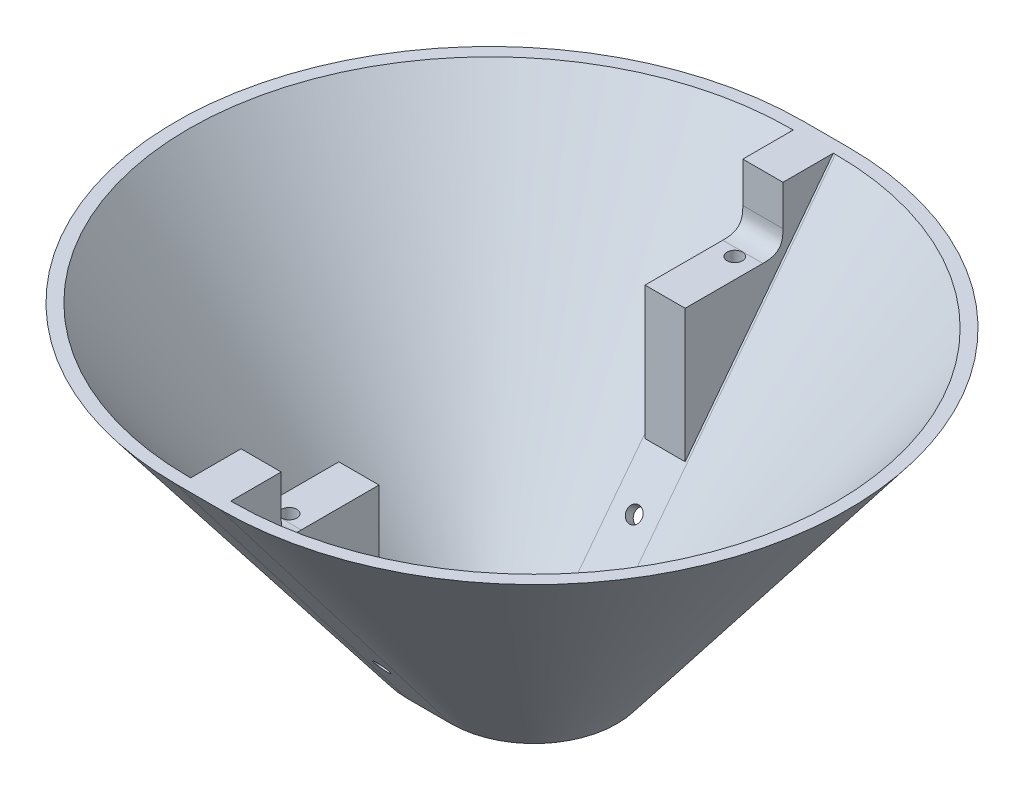
ISO-10303-21;
HEADER;
FILE_DESCRIPTION(('STEP AP214'),'2;1');
FILE_NAME('part.step','',(''),(''),'','','');
FILE_SCHEMA(('AUTOMOTIVE_DESIGN { 1 0 10303 214 1 1 1 1 }'));
ENDSEC;
DATA;
#1=APPLICATION_CONTEXT('core data for automotive mechanical design processes');
#2=APPLICATION_PROTOCOL_DEFINITION('international standard','automotive_design',2000,#1);
#3=PRODUCT_CONTEXT('',#1,'mechanical');
#4=PRODUCT('Part','Part','',(#3));
#5=PRODUCT_RELATED_PRODUCT_CATEGORY('part','',(#4));
#6=PRODUCT_DEFINITION_FORMATION('','',#4);
#7=PRODUCT_DEFINITION_CONTEXT('part definition',#1,'design');
#8=PRODUCT_DEFINITION('design','',#6,#7);
#9=PRODUCT_DEFINITION_SHAPE('','',#8);
#10=(LENGTH_UNIT() NAMED_UNIT(*) SI_UNIT(.MILLI.,.METRE.));
#11=(NAMED_UNIT(*) PLANE_ANGLE_UNIT() SI_UNIT($,.RADIAN.));
#12=(NAMED_UNIT(*) SI_UNIT($,.STERADIAN.) SOLID_ANGLE_UNIT());
#13=UNCERTAINTY_MEASURE_WITH_UNIT(LENGTH_MEASURE(1.E-05),#10,'distance_accuracy_value','');
#14=(GEOMETRIC_REPRESENTATION_CONTEXT(3) GLOBAL_UNCERTAINTY_ASSIGNED_CONTEXT((#13)) GLOBAL_UNIT_ASSIGNED_CONTEXT((#10,
#11,#12)) REPRESENTATION_CONTEXT('',''));
#15=CARTESIAN_POINT('',(0.,0.,0.));
#16=DIRECTION('',(0.,0.,1.));
#17=DIRECTION('',(1.,0.,0.));
#18=AXIS2_PLACEMENT_3D('',#15,#16,#17);
#19=CARTESIAN_POINT('',(-2.,12.15,-15.255049172629));
#20=DIRECTION('',(0.,0.,1.));
#21=DIRECTION('',(1.,0.,0.));
#22=AXIS2_PLACEMENT_3D('',#19,#20,#21);
#23=PLANE('',#22);
#24=DIRECTION('',(0.,-1.,0.));
#25=VECTOR('',#24,1.);
#26=CARTESIAN_POINT('',(2.,12.15,-15.255049172629));
#27=LINE('',#26,#25);
#28=CARTESIAN_POINT('',(2.,27.0393487414483,-15.255049172629));
#29=VERTEX_POINT('',#28);
#30=CARTESIAN_POINT('',(2.,13.7926796317046,-15.255049172629));
#31=VERTEX_POINT('',#30);
#32=EDGE_CURVE('E196',#29,#31,#27,.T.);
#33=ORIENTED_EDGE('',*,*,#32,.F.);
#34=DIRECTION('',(1.,0.,0.));
#35=VECTOR('',#34,1.);
#36=CARTESIAN_POINT('',(-2.,27.0393487414483,-15.255049172629));
#37=LINE('',#36,#35);
#38=CARTESIAN_POINT('',(-2.,27.0393487414483,-15.255049172629));
#39=VERTEX_POINT('',#38);
#40=EDGE_CURVE('E183',#39,#29,#37,.T.);
#41=ORIENTED_EDGE('',*,*,#40,.F.);
#42=DIRECTION('',(0.,-1.,0.));
#43=VECTOR('',#42,1.);
#44=CARTESIAN_POINT('',(-2.,12.15,-15.255049172629));
#45=LINE('',#44,#43);
#46=CARTESIAN_POINT('',(-2.,13.7926796317046,-15.255049172629));
#47=VERTEX_POINT('',#46);
#48=EDGE_CURVE('E194',#39,#47,#45,.T.);
#49=ORIENTED_EDGE('',*,*,#48,.T.);
#50=DIRECTION('',(-1.,0.,0.));
#51=VECTOR('',#50,1.);
#52=CARTESIAN_POINT('',(0.,13.7926796317046,-15.255049172629));
#53=LINE('',#52,#51);
#54=EDGE_CURVE('E313',#31,#47,#53,.T.);
#55=ORIENTED_EDGE('',*,*,#54,.F.);
#56=EDGE_LOOP('',(#33,#41,#49,#55));
#57=FACE_BOUND('',#56,.T.);
#58=ADVANCED_FACE('F38',(#57),#23,.T.);
#59=CARTESIAN_POINT('',(-2.19999999999997,3.03934874144826,7.00372816986759));
#60=DIRECTION('',(0.,1.,0.));
#61=DIRECTION('',(0.,0.,1.));
#62=AXIS2_PLACEMENT_3D('',#59,#60,#61);
#63=PLANE('',#62);
#64=DIRECTION('',(-1.,0.,0.));
#65=VECTOR('',#64,1.);
#66=CARTESIAN_POINT('',(0.,3.03934874144826,7.00372816986759));
#67=LINE('',#66,#65);
#68=CARTESIAN_POINT('',(2.19999999999997,3.03934874144826,7.00372816986759));
#69=VERTEX_POINT('',#68);
#70=CARTESIAN_POINT('',(-2.19999999999997,3.03934874144826,7.00372816986759));
#71=VERTEX_POINT('',#70);
#72=EDGE_CURVE('E274',#69,#71,#67,.T.);
#73=ORIENTED_EDGE('',*,*,#72,.F.);
#74=CARTESIAN_POINT('',(2.2,3.03934874144826,0.));
#75=DIRECTION('',(0.,1.,0.));
#76=DIRECTION('',(0.,0.,-1.));
#77=AXIS2_PLACEMENT_3D('',#74,#75,#76);
#78=CIRCLE('',#77,7.00372816986759);
#79=CARTESIAN_POINT('',(2.19999999999998,3.03934874144826,-7.00372816986759));
#80=VERTEX_POINT('',#79);
#81=EDGE_CURVE('E253',#69,#80,#78,.T.);
#82=ORIENTED_EDGE('',*,*,#81,.T.);
#83=DIRECTION('',(-1.,0.,0.));
#84=VECTOR('',#83,1.);
#85=CARTESIAN_POINT('',(0.,3.03934874144826,-7.0037281698676));
#86=LINE('',#85,#84);
#87=CARTESIAN_POINT('',(-2.19999999999998,3.03934874144826,-7.00372816986759));
#88=VERTEX_POINT('',#87);
#89=EDGE_CURVE('E267',#80,#88,#86,.T.);
#90=ORIENTED_EDGE('',*,*,#89,.T.);
#91=CARTESIAN_POINT('',(-2.2,3.03934874144826,0.));
#92=DIRECTION('',(0.,-1.,0.));
#93=DIRECTION('',(0.,0.,-1.));
#94=AXIS2_PLACEMENT_3D('',#91,#92,#93);
#95=CIRCLE('',#94,7.00372816986759);
#96=EDGE_CURVE('E298',#71,#88,#95,.T.);
#97=ORIENTED_EDGE('',*,*,#96,.F.);
#98=EDGE_LOOP('',(#73,#82,#90,#97));
#99=FACE_BOUND('',#98,.T.);
#100=CARTESIAN_POINT('',(-2.2,3.03934874144826,0.));
#101=DIRECTION('',(0.,-1.,0.));
#102=DIRECTION('',(0.,0.,-1.));
#103=AXIS2_PLACEMENT_3D('',#100,#101,#102);
#104=CIRCLE('',#103,8.26420058387785);
#105=CARTESIAN_POINT('',(-2.19999999999997,3.03934874144826,8.26420058387785));
#106=VERTEX_POINT('',#105);
#107=CARTESIAN_POINT('',(-2.20000000000003,3.03934874144826,-8.26420058387786));
#108=VERTEX_POINT('',#107);
#109=EDGE_CURVE('E307',#106,#108,#104,.T.);
#110=ORIENTED_EDGE('',*,*,#109,.T.);
#111=DIRECTION('',(-1.,0.,0.));
#112=VECTOR('',#111,1.);
#113=CARTESIAN_POINT('',(0.,3.03934874144826,-8.26420058387786));
#114=LINE('',#113,#112);
#115=CARTESIAN_POINT('',(2.20000000000003,3.03934874144826,-8.26420058387786));
#116=VERTEX_POINT('',#115);
#117=EDGE_CURVE('E265',#116,#108,#114,.T.);
#118=ORIENTED_EDGE('',*,*,#117,.F.);
#119=CARTESIAN_POINT('',(2.2,3.03934874144826,0.));
#120=DIRECTION('',(0.,1.,0.));
#121=DIRECTION('',(0.,0.,-1.));
#122=AXIS2_PLACEMENT_3D('',#119,#120,#121);
#123=CIRCLE('',#122,8.26420058387785);
#124=CARTESIAN_POINT('',(2.19999999999997,3.03934874144826,8.26420058387785));
#125=VERTEX_POINT('',#124);
#126=EDGE_CURVE('E262',#125,#116,#123,.T.);
#127=ORIENTED_EDGE('',*,*,#126,.F.);
#128=DIRECTION('',(-1.,0.,0.));
#129=VECTOR('',#128,1.);
#130=CARTESIAN_POINT('',(0.,3.03934874144826,8.26420058387785));
#131=LINE('',#130,#129);
#132=EDGE_CURVE('E277',#125,#106,#131,.T.);
#133=ORIENTED_EDGE('',*,*,#132,.T.);
#134=EDGE_LOOP('',(#110,#118,#127,#133));
#135=FACE_BOUND('',#134,.T.);
#136=ADVANCED_FACE('F600',(#99,#135),#63,.F.);
#137=CARTESIAN_POINT('',(-2.2,33.0393487414483,0.));
#138=DIRECTION('',(0.,1.,0.));
#139=DIRECTION('',(0.,0.,1.));
#140=AXIS2_PLACEMENT_3D('',#137,#138,#139);
#141=CONICAL_SURFACE('',#140,31.2840102232464,0.654498469497869);
#142=CARTESIAN_POINT('',(-2.2,33.0393487414483,0.));
#143=DIRECTION('',(0.,-1.,0.));
#144=DIRECTION('',(0.,0.,-1.));
#145=AXIS2_PLACEMENT_3D('',#142,#143,#144);
#146=CIRCLE('',#145,31.2840102232464);
#147=CARTESIAN_POINT('',(-2.19999999999989,33.0393487414483,31.2840102232464));
#148=VERTEX_POINT('',#147);
#149=CARTESIAN_POINT('',(-2.2000000000001,33.0393487414483,-31.2840102232464));
#150=VERTEX_POINT('',#149);
#151=EDGE_CURVE('E304',#148,#150,#146,.T.);
#152=ORIENTED_EDGE('',*,*,#151,.T.);
#153=DIRECTION('',(0.,-0.793353340291238,0.608761429008717));
#154=VECTOR('',#153,1.);
#155=CARTESIAN_POINT('',(-2.19999999999998,3.03934874144826,-8.26420058387786));
#156=LINE('',#155,#154);
#157=EDGE_CURVE('E289',#150,#108,#156,.T.);
#158=ORIENTED_EDGE('',*,*,#157,.T.);
#159=ORIENTED_EDGE('',*,*,#109,.F.);
#160=DIRECTION('',(0.,-0.793353340291238,-0.608761429008717));
#161=VECTOR('',#160,1.);
#162=CARTESIAN_POINT('',(-2.19999999999997,3.03934874144826,8.26420058387785));
#163=LINE('',#162,#161);
#164=EDGE_CURVE('E295',#148,#106,#163,.T.);
#165=ORIENTED_EDGE('',*,*,#164,.F.);
#166=EDGE_LOOP('',(#152,#158,#159,#165));
#167=FACE_BOUND('',#166,.T.);
#168=ADVANCED_FACE('F411',(#167),#141,.T.);
#169=CARTESIAN_POINT('',(-2.19999999999989,33.0393487414483,30.0235378092362));
#170=DIRECTION('',(0.,-1.,0.));
#171=DIRECTION('',(0.,0.,-1.));
#172=AXIS2_PLACEMENT_3D('',#169,#170,#171);
#173=PLANE('',#172);
#174=DIRECTION('',(-1.,0.,0.));
#175=VECTOR('',#174,1.);
#176=CARTESIAN_POINT('',(-1.04950770296597E-13,33.0393487414483,-31.2840102232464));
#177=LINE('',#176,#175);
#178=CARTESIAN_POINT('',(2.2000000000001,33.0393487414483,-31.2840102232464));
#179=VERTEX_POINT('',#178);
#180=EDGE_CURVE('E272',#179,#150,#177,.T.);
#181=ORIENTED_EDGE('',*,*,#180,.T.);
#182=ORIENTED_EDGE('',*,*,#151,.F.);
#183=DIRECTION('',(-1.,0.,0.));
#184=VECTOR('',#183,1.);
#185=CARTESIAN_POINT('',(1.13624387676481E-13,33.0393487414483,31.2840102232464));
#186=LINE('',#185,#184);
#187=CARTESIAN_POINT('',(2.19999999999989,33.0393487414483,31.2840102232464));
#188=VERTEX_POINT('',#187);
#189=EDGE_CURVE('E280',#188,#148,#186,.T.);
#190=ORIENTED_EDGE('',*,*,#189,.F.);
#191=CARTESIAN_POINT('',(2.2,33.0393487414483,0.));
#192=DIRECTION('',(0.,1.,0.));
#193=DIRECTION('',(0.,0.,-1.));
#194=AXIS2_PLACEMENT_3D('',#191,#192,#193);
#195=CIRCLE('',#194,31.2840102232464);
#196=EDGE_CURVE('E259',#188,#179,#195,.T.);
#197=ORIENTED_EDGE('',*,*,#196,.T.);
#198=EDGE_LOOP('',(#181,#182,#190,#197));
#199=FACE_BOUND('',#198,.T.);
#200=DIRECTION('',(0.,0.,1.));
#201=VECTOR('',#200,1.);
#202=CARTESIAN_POINT('',(-2.,33.0393487414483,-15.255049172629));
#203=LINE('',#202,#201);
#204=CARTESIAN_POINT('',(-2.,33.0393487414483,-30.0235378092362));
#205=VERTEX_POINT('',#204);
#206=CARTESIAN_POINT('',(-2.,33.0393487414483,-25.));
#207=VERTEX_POINT('',#206);
#208=EDGE_CURVE('E203',#205,#207,#203,.T.);
#209=ORIENTED_EDGE('',*,*,#208,.T.);
#210=DIRECTION('',(-1.,0.,0.));
#211=VECTOR('',#210,1.);
#212=CARTESIAN_POINT('',(-2.,33.0393487414483,-25.));
#213=LINE('',#212,#211);
#214=CARTESIAN_POINT('',(2.,33.0393487414483,-25.));
#215=VERTEX_POINT('',#214);
#216=EDGE_CURVE('E189',#215,#207,#213,.T.);
#217=ORIENTED_EDGE('',*,*,#216,.F.);
#218=DIRECTION('',(0.,0.,1.));
#219=VECTOR('',#218,1.);
#220=CARTESIAN_POINT('',(2.,33.0393487414483,-15.255049172629));
#221=LINE('',#220,#219);
#222=CARTESIAN_POINT('',(2.,33.0393487414483,-30.0235378092362));
#223=VERTEX_POINT('',#222);
#224=EDGE_CURVE('E204',#223,#215,#221,.T.);
#225=ORIENTED_EDGE('',*,*,#224,.F.);
#226=DIRECTION('',(-1.,0.,0.));
#227=VECTOR('',#226,1.);
#228=CARTESIAN_POINT('',(-1.00613961606655E-13,33.0393487414483,-30.0235378092362));
#229=LINE('',#228,#227);
#230=CARTESIAN_POINT('',(2.2000000000001,33.0393487414483,-30.0235378092362));
#231=VERTEX_POINT('',#230);
#232=EDGE_CURVE('E270',#231,#223,#229,.T.);
#233=ORIENTED_EDGE('',*,*,#232,.F.);
#234=CARTESIAN_POINT('',(2.2,33.0393487414483,0.));
#235=DIRECTION('',(0.,1.,0.));
#236=DIRECTION('',(0.,0.,-1.));
#237=AXIS2_PLACEMENT_3D('',#234,#235,#236);
#238=CIRCLE('',#237,30.0235378092362);
#239=CARTESIAN_POINT('',(2.19999999999989,33.0393487414483,30.0235378092362));
#240=VERTEX_POINT('',#239);
#241=EDGE_CURVE('E256',#240,#231,#238,.T.);
#242=ORIENTED_EDGE('',*,*,#241,.F.);
#243=DIRECTION('',(-1.,0.,0.));
#244=VECTOR('',#243,1.);
#245=CARTESIAN_POINT('',(1.09287578986539E-13,33.0393487414483,30.0235378092362));
#246=LINE('',#245,#244);
#247=CARTESIAN_POINT('',(2.,33.0393487414483,30.0235378092361));
#248=VERTEX_POINT('',#247);
#249=EDGE_CURVE('E283',#240,#248,#246,.T.);
#250=ORIENTED_EDGE('',*,*,#249,.T.);
#251=DIRECTION('',(0.,0.,1.));
#252=VECTOR('',#251,1.);
#253=CARTESIAN_POINT('',(2.,33.0393487414483,15.255049172629));
#254=LINE('',#253,#252);
#255=CARTESIAN_POINT('',(2.,33.0393487414483,25.));
#256=VERTEX_POINT('',#255);
#257=EDGE_CURVE('E215',#256,#248,#254,.T.);
#258=ORIENTED_EDGE('',*,*,#257,.F.);
#259=DIRECTION('',(1.,0.,0.));
#260=VECTOR('',#259,1.);
#261=CARTESIAN_POINT('',(2.,33.0393487414483,25.));
#262=LINE('',#261,#260);
#263=CARTESIAN_POINT('',(-2.,33.0393487414483,25.));
#264=VERTEX_POINT('',#263);
#265=EDGE_CURVE('E321',#264,#256,#262,.T.);
#266=ORIENTED_EDGE('',*,*,#265,.F.);
#267=DIRECTION('',(0.,0.,1.));
#268=VECTOR('',#267,1.);
#269=CARTESIAN_POINT('',(-2.,33.0393487414483,15.255049172629));
#270=LINE('',#269,#268);
#271=CARTESIAN_POINT('',(-2.,33.0393487414483,30.0235378092362));
#272=VERTEX_POINT('',#271);
#273=EDGE_CURVE('E220',#264,#272,#270,.T.);
#274=ORIENTED_EDGE('',*,*,#273,.T.);
#275=CARTESIAN_POINT('',(-2.19999999999989,33.0393487414483,30.0235378092362));
#276=VERTEX_POINT('',#275);
#277=EDGE_CURVE('E282',#272,#276,#246,.T.);
#278=ORIENTED_EDGE('',*,*,#277,.T.);
#279=CARTESIAN_POINT('',(-2.2,33.0393487414483,0.));
#280=DIRECTION('',(0.,-1.,0.));
#281=DIRECTION('',(0.,0.,-1.));
#282=AXIS2_PLACEMENT_3D('',#279,#280,#281);
#283=CIRCLE('',#282,30.0235378092362);
#284=CARTESIAN_POINT('',(-2.2000000000001,33.0393487414483,-30.0235378092362));
#285=VERTEX_POINT('',#284);
#286=EDGE_CURVE('E301',#276,#285,#283,.T.);
#287=ORIENTED_EDGE('',*,*,#286,.T.);
#288=EDGE_CURVE('E269',#205,#285,#229,.T.);
#289=ORIENTED_EDGE('',*,*,#288,.F.);
#290=EDGE_LOOP('',(#209,#217,#225,#233,#242,#250,#258,#266,#274,#278,#287,#289));
#291=FACE_BOUND('',#290,.T.);
#292=ADVANCED_FACE('F605',(#199,#291),#173,.F.);
#293=CARTESIAN_POINT('',(-2.2,3.03934874144826,0.));
#294=DIRECTION('',(0.,1.,0.));
#295=DIRECTION('',(0.,0.,1.));
#296=AXIS2_PLACEMENT_3D('',#293,#294,#295);
#297=CONICAL_SURFACE('',#296,7.00372816986759,0.654498469497869);
#298=DIRECTION('',(0.,0.793353340291238,0.608761429008717));
#299=VECTOR('',#298,1.);
#300=CARTESIAN_POINT('',(-2.19999999999989,33.0393487414483,30.0235378092362));
#301=LINE('',#300,#299);
#302=EDGE_CURVE('E292',#71,#276,#301,.T.);
#303=ORIENTED_EDGE('',*,*,#302,.F.);
#304=ORIENTED_EDGE('',*,*,#96,.T.);
#305=DIRECTION('',(0.,0.793353340291238,-0.608761429008717));
#306=VECTOR('',#305,1.);
#307=CARTESIAN_POINT('',(-2.1999999999999,33.0393487414483,-30.0235378092362));
#308=LINE('',#307,#306);
#309=EDGE_CURVE('E286',#88,#285,#308,.T.);
#310=ORIENTED_EDGE('',*,*,#309,.T.);
#311=ORIENTED_EDGE('',*,*,#286,.F.);
#312=EDGE_LOOP('',(#303,#304,#310,#311));
#313=FACE_BOUND('',#312,.T.);
#314=ADVANCED_FACE('F598',(#313),#297,.F.);
#315=CARTESIAN_POINT('',(1.09287578986539E-13,33.0393487414483,30.0235378092362));
#316=DIRECTION('',(0.,-0.608761429008717,0.793353340291238));
#317=DIRECTION('',(0.,-0.793353340291238,-0.608761429008717));
#318=AXIS2_PLACEMENT_3D('',#315,#316,#317);
#319=PLANE('',#318);
#320=CARTESIAN_POINT('',(0.,9.77897929181878,12.1752285801743));
#321=DIRECTION('',(0.,-0.608761429008716,0.793353340291238));
#322=DIRECTION('',(0.,-0.793353340291238,-0.608761429008716));
#323=AXIS2_PLACEMENT_3D('',#320,#321,#322);
#324=CIRCLE('',#323,0.760000000000002);
#325=CARTESIAN_POINT('',(0.,9.17603075319744,11.7125698941277));
#326=VERTEX_POINT('',#325);
#327=EDGE_CURVE('E236',#326,#326,#324,.T.);
#328=ORIENTED_EDGE('',*,*,#327,.T.);
#329=EDGE_LOOP('',(#328));
#330=FACE_BOUND('',#329,.T.);
#331=ORIENTED_EDGE('',*,*,#277,.F.);
#332=DIRECTION('',(0.,-0.793353340291238,-0.608761429008717));
#333=VECTOR('',#332,1.);
#334=CARTESIAN_POINT('',(-2.,33.0393487414483,30.0235378092362));
#335=LINE('',#334,#333);
#336=CARTESIAN_POINT('',(-2.,13.7926796317046,15.255049172629));
#337=VERTEX_POINT('',#336);
#338=EDGE_CURVE('E225',#272,#337,#335,.T.);
#339=ORIENTED_EDGE('',*,*,#338,.T.);
#340=DIRECTION('',(1.,0.,0.));
#341=VECTOR('',#340,1.);
#342=CARTESIAN_POINT('',(1.97007027034586E-13,13.7926796317046,15.255049172629));
#343=LINE('',#342,#341);
#344=CARTESIAN_POINT('',(2.,13.7926796317046,15.255049172629));
#345=VERTEX_POINT('',#344);
#346=EDGE_CURVE('E227',#337,#345,#343,.T.);
#347=ORIENTED_EDGE('',*,*,#346,.T.);
#348=DIRECTION('',(0.,-0.793353340291238,-0.608761429008717));
#349=VECTOR('',#348,1.);
#350=CARTESIAN_POINT('',(2.,33.0393487414483,30.0235378092361));
#351=LINE('',#350,#349);
#352=EDGE_CURVE('E222',#248,#345,#351,.T.);
#353=ORIENTED_EDGE('',*,*,#352,.F.);
#354=ORIENTED_EDGE('',*,*,#249,.F.);
#355=DIRECTION('',(0.,0.793353340291238,0.608761429008717));
#356=VECTOR('',#355,1.);
#357=CARTESIAN_POINT('',(2.19999999999989,33.0393487414483,30.0235378092362));
#358=LINE('',#357,#356);
#359=EDGE_CURVE('E247',#69,#240,#358,.T.);
#360=ORIENTED_EDGE('',*,*,#359,.F.);
#361=ORIENTED_EDGE('',*,*,#72,.T.);
#362=ORIENTED_EDGE('',*,*,#302,.T.);
#363=EDGE_LOOP('',(#331,#339,#347,#353,#354,#360,#361,#362));
#364=FACE_BOUND('',#363,.T.);
#365=ADVANCED_FACE('F594',(#330,#364),#319,.F.);
#366=CARTESIAN_POINT('',(0.,3.03934874144826,8.26420058387785));
#367=DIRECTION('',(0.,0.608761429008717,-0.793353340291238));
#368=DIRECTION('',(0.,0.793353340291238,0.608761429008717));
#369=AXIS2_PLACEMENT_3D('',#366,#367,#368);
#370=PLANE('',#369);
#371=ORIENTED_EDGE('',*,*,#189,.T.);
#372=ORIENTED_EDGE('',*,*,#164,.T.);
#373=ORIENTED_EDGE('',*,*,#132,.F.);
#374=DIRECTION('',(0.,-0.793353340291238,-0.608761429008717));
#375=VECTOR('',#374,1.);
#376=CARTESIAN_POINT('',(2.19999999999997,3.03934874144826,8.26420058387785));
#377=LINE('',#376,#375);
#378=EDGE_CURVE('E250',#188,#125,#377,.T.);
#379=ORIENTED_EDGE('',*,*,#378,.F.);
#380=EDGE_LOOP('',(#371,#372,#373,#379));
#381=FACE_BOUND('',#380,.T.);
#382=CARTESIAN_POINT('',(0.,9.17021786281006,12.9685819204656));
#383=DIRECTION('',(0.,0.608761429008717,-0.793353340291238));
#384=DIRECTION('',(0.,0.793353340291238,0.608761429008717));
#385=AXIS2_PLACEMENT_3D('',#382,#383,#384);
#386=CIRCLE('',#385,0.760000000000002);
#387=CARTESIAN_POINT('',(0.,9.77316640143141,13.4312406065122));
#388=VERTEX_POINT('',#387);
#389=EDGE_CURVE('E235',#388,#388,#386,.T.);
#390=ORIENTED_EDGE('',*,*,#389,.T.);
#391=EDGE_LOOP('',(#390));
#392=FACE_BOUND('',#391,.T.);
#393=ADVANCED_FACE('F590',(#381,#392),#370,.F.);
#394=CARTESIAN_POINT('',(-1.04950770296597E-13,33.0393487414483,-31.2840102232464));
#395=DIRECTION('',(0.,0.608761429008717,0.793353340291238));
#396=DIRECTION('',(0.,-0.793353340291238,0.608761429008717));
#397=AXIS2_PLACEMENT_3D('',#394,#395,#396);
#398=PLANE('',#397);
#399=CARTESIAN_POINT('',(0.,9.17021786281005,-12.9685819204656));
#400=DIRECTION('',(0.,0.608761429008717,0.793353340291238));
#401=DIRECTION('',(0.,-0.793353340291238,0.608761429008717));
#402=AXIS2_PLACEMENT_3D('',#399,#400,#401);
#403=CIRCLE('',#402,0.760000000000002);
#404=CARTESIAN_POINT('',(0.,8.56726932418871,-12.5059232344189));
#405=VERTEX_POINT('',#404);
#406=EDGE_CURVE('E232',#405,#405,#403,.F.);
#407=ORIENTED_EDGE('',*,*,#406,.F.);
#408=EDGE_LOOP('',(#407));
#409=FACE_BOUND('',#408,.T.);
#410=ORIENTED_EDGE('',*,*,#157,.F.);
#411=ORIENTED_EDGE('',*,*,#180,.F.);
#412=DIRECTION('',(0.,-0.793353340291238,0.608761429008717));
#413=VECTOR('',#412,1.);
#414=CARTESIAN_POINT('',(2.19999999999998,3.03934874144826,-8.26420058387786));
#415=LINE('',#414,#413);
#416=EDGE_CURVE('E244',#179,#116,#415,.T.);
#417=ORIENTED_EDGE('',*,*,#416,.T.);
#418=ORIENTED_EDGE('',*,*,#117,.T.);
#419=EDGE_LOOP('',(#410,#411,#417,#418));
#420=FACE_BOUND('',#419,.T.);
#421=ADVANCED_FACE('F586',(#409,#420),#398,.F.);
#422=CARTESIAN_POINT('',(0.,3.03934874144826,-7.0037281698676));
#423=DIRECTION('',(0.,-0.608761429008717,-0.793353340291238));
#424=DIRECTION('',(0.,0.793353340291238,-0.608761429008717));
#425=AXIS2_PLACEMENT_3D('',#422,#423,#424);
#426=PLANE('',#425);
#427=CARTESIAN_POINT('',(0.,9.77897929181878,-12.1752285801743));
#428=DIRECTION('',(0.,0.608761429008716,0.793353340291238));
#429=DIRECTION('',(0.,-0.793353340291238,0.608761429008716));
#430=AXIS2_PLACEMENT_3D('',#427,#428,#429);
#431=CIRCLE('',#430,0.760000000000002);
#432=CARTESIAN_POINT('',(0.,9.17603075319744,-11.7125698941277));
#433=VERTEX_POINT('',#432);
#434=EDGE_CURVE('E229',#433,#433,#431,.T.);
#435=ORIENTED_EDGE('',*,*,#434,.F.);
#436=EDGE_LOOP('',(#435));
#437=FACE_BOUND('',#436,.T.);
#438=ORIENTED_EDGE('',*,*,#54,.T.);
#439=DIRECTION('',(0.,0.793353340291238,-0.608761429008717));
#440=VECTOR('',#439,1.);
#441=CARTESIAN_POINT('',(-2.,3.03934874144827,-7.0037281698676));
#442=LINE('',#441,#440);
#443=EDGE_CURVE('E202',#47,#205,#442,.T.);
#444=ORIENTED_EDGE('',*,*,#443,.T.);
#445=ORIENTED_EDGE('',*,*,#288,.T.);
#446=ORIENTED_EDGE('',*,*,#309,.F.);
#447=ORIENTED_EDGE('',*,*,#89,.F.);
#448=DIRECTION('',(0.,0.793353340291238,-0.608761429008717));
#449=VECTOR('',#448,1.);
#450=CARTESIAN_POINT('',(2.1999999999999,33.0393487414483,-30.0235378092362));
#451=LINE('',#450,#449);
#452=EDGE_CURVE('E239',#80,#231,#451,.T.);
#453=ORIENTED_EDGE('',*,*,#452,.T.);
#454=ORIENTED_EDGE('',*,*,#232,.T.);
#455=DIRECTION('',(0.,0.793353340291238,-0.608761429008717));
#456=VECTOR('',#455,1.);
#457=CARTESIAN_POINT('',(2.,3.03934874144826,-7.00372816986761));
#458=LINE('',#457,#456);
#459=EDGE_CURVE('E310',#31,#223,#458,.T.);
#460=ORIENTED_EDGE('',*,*,#459,.F.);
#461=EDGE_LOOP('',(#438,#444,#445,#446,#447,#453,#454,#460));
#462=FACE_BOUND('',#461,.T.);
#463=ADVANCED_FACE('F582',(#437,#462),#426,.F.);
#464=CARTESIAN_POINT('',(2.2,33.0393487414483,0.));
#465=DIRECTION('',(0.,1.,0.));
#466=DIRECTION('',(0.,0.,1.));
#467=AXIS2_PLACEMENT_3D('',#464,#465,#466);
#468=CONICAL_SURFACE('',#467,31.2840102232464,0.654498469497869);
#469=ORIENTED_EDGE('',*,*,#196,.F.);
#470=ORIENTED_EDGE('',*,*,#378,.T.);
#471=ORIENTED_EDGE('',*,*,#126,.T.);
#472=ORIENTED_EDGE('',*,*,#416,.F.);
#473=EDGE_LOOP('',(#469,#470,#471,#472));
#474=FACE_BOUND('',#473,.T.);
#475=ADVANCED_FACE('F578',(#474),#468,.T.);
#476=CARTESIAN_POINT('',(2.2,3.03934874144826,0.));
#477=DIRECTION('',(0.,1.,0.));
#478=DIRECTION('',(0.,0.,1.));
#479=AXIS2_PLACEMENT_3D('',#476,#477,#478);
#480=CONICAL_SURFACE('',#479,7.00372816986759,0.654498469497869);
#481=ORIENTED_EDGE('',*,*,#359,.T.);
#482=ORIENTED_EDGE('',*,*,#241,.T.);
#483=ORIENTED_EDGE('',*,*,#452,.F.);
#484=ORIENTED_EDGE('',*,*,#81,.F.);
#485=EDGE_LOOP('',(#481,#482,#483,#484));
#486=FACE_BOUND('',#485,.T.);
#487=ADVANCED_FACE('F574',(#486),#480,.F.);
#488=CARTESIAN_POINT('',(0.,-1.94835001404263,27.4585816872373));
#489=DIRECTION('',(0.,0.608761429008716,-0.793353340291238));
#490=DIRECTION('',(0.,0.793353340291239,0.608761429008716));
#491=AXIS2_PLACEMENT_3D('',#488,#489,#490);
#492=CYLINDRICAL_SURFACE('',#491,0.760000000000002);
#493=ORIENTED_EDGE('',*,*,#327,.F.);
#494=EDGE_LOOP('',(#493));
#495=FACE_BOUND('',#494,.T.);
#496=ORIENTED_EDGE('',*,*,#389,.F.);
#497=EDGE_LOOP('',(#496));
#498=FACE_BOUND('',#497,.T.);
#499=ADVANCED_FACE('F570',(#495,#498),#492,.F.);
#500=CARTESIAN_POINT('',(0.,-1.94835001404263,-27.4585816872373));
#501=DIRECTION('',(0.,0.608761429008716,0.793353340291238));
#502=DIRECTION('',(0.,-0.793353340291239,0.608761429008716));
#503=AXIS2_PLACEMENT_3D('',#500,#501,#502);
#504=CYLINDRICAL_SURFACE('',#503,0.760000000000002);
#505=ORIENTED_EDGE('',*,*,#434,.T.);
#506=EDGE_LOOP('',(#505));
#507=FACE_BOUND('',#506,.T.);
#508=ORIENTED_EDGE('',*,*,#406,.T.);
#509=EDGE_LOOP('',(#508));
#510=FACE_BOUND('',#509,.T.);
#511=ADVANCED_FACE('F566',(#507,#510),#504,.F.);
#512=CARTESIAN_POINT('',(-2.,12.15,15.255049172629));
#513=DIRECTION('',(0.,0.,-1.));
#514=DIRECTION('',(-1.,0.,0.));
#515=AXIS2_PLACEMENT_3D('',#512,#513,#514);
#516=PLANE('',#515);
#517=DIRECTION('',(-1.,0.,0.));
#518=VECTOR('',#517,1.);
#519=CARTESIAN_POINT('',(2.,27.0393487414483,15.255049172629));
#520=LINE('',#519,#518);
#521=CARTESIAN_POINT('',(2.,27.0393487414483,15.255049172629));
#522=VERTEX_POINT('',#521);
#523=CARTESIAN_POINT('',(-2.,27.0393487414483,15.255049172629));
#524=VERTEX_POINT('',#523);
#525=EDGE_CURVE('E320',#522,#524,#520,.T.);
#526=ORIENTED_EDGE('',*,*,#525,.F.);
#527=DIRECTION('',(0.,1.,0.));
#528=VECTOR('',#527,1.);
#529=CARTESIAN_POINT('',(2.,12.15,15.255049172629));
#530=LINE('',#529,#528);
#531=EDGE_CURVE('E207',#345,#522,#530,.T.);
#532=ORIENTED_EDGE('',*,*,#531,.F.);
#533=ORIENTED_EDGE('',*,*,#346,.F.);
#534=DIRECTION('',(0.,1.,0.));
#535=VECTOR('',#534,1.);
#536=CARTESIAN_POINT('',(-2.,12.15,15.255049172629));
#537=LINE('',#536,#535);
#538=EDGE_CURVE('E217',#337,#524,#537,.T.);
#539=ORIENTED_EDGE('',*,*,#538,.T.);
#540=EDGE_LOOP('',(#526,#532,#533,#539));
#541=FACE_BOUND('',#540,.T.);
#542=ADVANCED_FACE('F548',(#541),#516,.T.);
#543=CARTESIAN_POINT('',(-2.,0.,0.));
#544=DIRECTION('',(-1.,0.,0.));
#545=DIRECTION('',(0.,0.,1.));
#546=AXIS2_PLACEMENT_3D('',#543,#544,#545);
#547=PLANE('',#546);
#548=DIRECTION('',(0.,1.,0.));
#549=VECTOR('',#548,1.);
#550=CARTESIAN_POINT('',(-2.,27.0393487414483,25.));
#551=LINE('',#550,#549);
#552=CARTESIAN_POINT('',(-2.,29.0393487414483,25.));
#553=VERTEX_POINT('',#552);
#554=EDGE_CURVE('E341',#553,#264,#551,.T.);
#555=ORIENTED_EDGE('',*,*,#554,.F.);
#556=CARTESIAN_POINT('',(-2.,27.0393487414483,23.));
#557=CARTESIAN_POINT('',(-2.,27.0393487414483,23.3363961030679));
#558=CARTESIAN_POINT('',(-2.,27.0393487414483,23.6727922061358));
#559=CARTESIAN_POINT('',(-2.,27.1827325811204,24.4142135623731));
#560=CARTESIAN_POINT('',(-2.,27.6251351790752,24.8566161603278));
#561=CARTESIAN_POINT('',(-2.,28.3665565353125,25.));
#562=CARTESIAN_POINT('',(-2.,28.7029526383804,25.));
#563=CARTESIAN_POINT('',(-2.,29.0393487414483,25.));
#564=B_SPLINE_CURVE_WITH_KNOTS('',5,(#556,#557,#558,#559,#560,#561,#562,#563),.UNSPECIFIED.,.F.,
.F.,(6,2,6),(0.,0.5,1.),.UNSPECIFIED.);
#565=CARTESIAN_POINT('',(-2.,27.0393487414483,23.));
#566=VERTEX_POINT('',#565);
#567=EDGE_CURVE('E847',#553,#566,#564,.F.);
#568=ORIENTED_EDGE('',*,*,#567,.T.);
#569=DIRECTION('',(0.,0.,1.));
#570=VECTOR('',#569,1.);
#571=CARTESIAN_POINT('',(-2.,27.0393487414483,15.255049172629));
#572=LINE('',#571,#570);
#573=EDGE_CURVE('E322',#524,#566,#572,.T.);
#574=ORIENTED_EDGE('',*,*,#573,.F.);
#575=ORIENTED_EDGE('',*,*,#538,.F.);
#576=ORIENTED_EDGE('',*,*,#338,.F.);
#577=ORIENTED_EDGE('',*,*,#273,.F.);
#578=EDGE_LOOP('',(#555,#568,#574,#575,#576,#577));
#579=FACE_BOUND('',#578,.T.);
#580=ADVANCED_FACE('F544',(#579),#547,.T.);
#581=CARTESIAN_POINT('',(2.,0.,0.));
#582=DIRECTION('',(-1.,0.,0.));
#583=DIRECTION('',(0.,0.,1.));
#584=AXIS2_PLACEMENT_3D('',#581,#582,#583);
#585=PLANE('',#584);
#586=DIRECTION('',(0.,0.,-1.));
#587=VECTOR('',#586,1.);
#588=CARTESIAN_POINT('',(2.,27.0393487414483,15.255049172629));
#589=LINE('',#588,#587);
#590=CARTESIAN_POINT('',(2.,27.0393487414483,23.));
#591=VERTEX_POINT('',#590);
#592=EDGE_CURVE('E317',#591,#522,#589,.T.);
#593=ORIENTED_EDGE('',*,*,#592,.F.);
#594=CARTESIAN_POINT('',(2.,29.0393487414483,25.));
#595=CARTESIAN_POINT('',(2.,28.7029526383804,25.));
#596=CARTESIAN_POINT('',(2.,28.3665565353125,25.));
#597=CARTESIAN_POINT('',(2.,27.6251351790752,24.8566161603278));
#598=CARTESIAN_POINT('',(2.,27.1827325811204,24.4142135623731));
#599=CARTESIAN_POINT('',(2.,27.0393487414483,23.6727922061358));
#600=CARTESIAN_POINT('',(2.,27.0393487414483,23.3363961030679));
#601=CARTESIAN_POINT('',(2.,27.0393487414483,23.));
#602=B_SPLINE_CURVE_WITH_KNOTS('',5,(#594,#595,#596,#597,#598,#599,#600,#601),.UNSPECIFIED.,.F.,
.F.,(6,2,6),(0.,0.5,1.),.UNSPECIFIED.);
#603=CARTESIAN_POINT('',(2.,29.0393487414483,25.));
#604=VERTEX_POINT('',#603);
#605=EDGE_CURVE('E391',#591,#604,#602,.F.);
#606=ORIENTED_EDGE('',*,*,#605,.T.);
#607=DIRECTION('',(0.,1.,0.));
#608=VECTOR('',#607,1.);
#609=CARTESIAN_POINT('',(2.,27.0393487414483,25.));
#610=LINE('',#609,#608);
#611=EDGE_CURVE('E338',#604,#256,#610,.T.);
#612=ORIENTED_EDGE('',*,*,#611,.T.);
#613=ORIENTED_EDGE('',*,*,#257,.T.);
#614=ORIENTED_EDGE('',*,*,#352,.T.);
#615=ORIENTED_EDGE('',*,*,#531,.T.);
#616=EDGE_LOOP('',(#593,#606,#612,#613,#614,#615));
#617=FACE_BOUND('',#616,.T.);
#618=ADVANCED_FACE('F535',(#617),#585,.F.);
#619=CARTESIAN_POINT('',(-2.,0.,0.));
#620=DIRECTION('',(-1.,0.,0.));
#621=DIRECTION('',(0.,0.,1.));
#622=AXIS2_PLACEMENT_3D('',#619,#620,#621);
#623=PLANE('',#622);
#624=DIRECTION('',(0.,0.,1.));
#625=VECTOR('',#624,1.);
#626=CARTESIAN_POINT('',(-2.,27.0393487414483,-25.));
#627=LINE('',#626,#625);
#628=CARTESIAN_POINT('',(-2.,27.0393487414483,-23.));
#629=VERTEX_POINT('',#628);
#630=EDGE_CURVE('E179',#629,#39,#627,.T.);
#631=ORIENTED_EDGE('',*,*,#630,.F.);
#632=CARTESIAN_POINT('',(-2.,29.0393487414483,-25.));
#633=CARTESIAN_POINT('',(-2.,28.7029526383804,-25.));
#634=CARTESIAN_POINT('',(-2.,28.3665565353125,-25.));
#635=CARTESIAN_POINT('',(-2.,27.6251351790752,-24.8566161603278));
#636=CARTESIAN_POINT('',(-2.,27.1827325811204,-24.4142135623731));
#637=CARTESIAN_POINT('',(-2.,27.0393487414483,-23.6727922061358));
#638=CARTESIAN_POINT('',(-2.,27.0393487414483,-23.3363961030679));
#639=CARTESIAN_POINT('',(-2.,27.0393487414483,-23.));
#640=B_SPLINE_CURVE_WITH_KNOTS('',5,(#632,#633,#634,#635,#636,#637,#638,#639),.UNSPECIFIED.,.F.,
.F.,(6,2,6),(0.,0.5,1.),.UNSPECIFIED.);
#641=CARTESIAN_POINT('',(-2.,29.0393487414483,-25.));
#642=VERTEX_POINT('',#641);
#643=EDGE_CURVE('E51',#629,#642,#640,.F.);
#644=ORIENTED_EDGE('',*,*,#643,.T.);
#645=DIRECTION('',(0.,1.,0.));
#646=VECTOR('',#645,1.);
#647=CARTESIAN_POINT('',(-2.,27.0393487414483,-25.));
#648=LINE('',#647,#646);
#649=EDGE_CURVE('E503',#642,#207,#648,.T.);
#650=ORIENTED_EDGE('',*,*,#649,.T.);
#651=ORIENTED_EDGE('',*,*,#208,.F.);
#652=ORIENTED_EDGE('',*,*,#443,.F.);
#653=ORIENTED_EDGE('',*,*,#48,.F.);
#654=EDGE_LOOP('',(#631,#644,#650,#651,#652,#653));
#655=FACE_BOUND('',#654,.T.);
#656=ADVANCED_FACE('F200',(#655),#623,.T.);
#657=CARTESIAN_POINT('',(2.,0.,0.));
#658=DIRECTION('',(-1.,0.,0.));
#659=DIRECTION('',(0.,0.,1.));
#660=AXIS2_PLACEMENT_3D('',#657,#658,#659);
#661=PLANE('',#660);
#662=ORIENTED_EDGE('',*,*,#224,.T.);
#663=DIRECTION('',(0.,1.,0.));
#664=VECTOR('',#663,1.);
#665=CARTESIAN_POINT('',(2.,27.0393487414483,-25.));
#666=LINE('',#665,#664);
#667=CARTESIAN_POINT('',(2.,29.0393487414483,-25.));
#668=VERTEX_POINT('',#667);
#669=EDGE_CURVE('E497',#668,#215,#666,.T.);
#670=ORIENTED_EDGE('',*,*,#669,.F.);
#671=CARTESIAN_POINT('',(2.,27.0393487414483,-23.));
#672=CARTESIAN_POINT('',(2.,27.0393487414483,-23.3363961030679));
#673=CARTESIAN_POINT('',(2.,27.0393487414483,-23.6727922061358));
#674=CARTESIAN_POINT('',(2.,27.1827325811204,-24.4142135623731));
#675=CARTESIAN_POINT('',(2.,27.6251351790752,-24.8566161603278));
#676=CARTESIAN_POINT('',(2.,28.3665565353125,-25.));
#677=CARTESIAN_POINT('',(2.,28.7029526383804,-25.));
#678=CARTESIAN_POINT('',(2.,29.0393487414483,-25.));
#679=B_SPLINE_CURVE_WITH_KNOTS('',5,(#671,#672,#673,#674,#675,#676,#677,#678),.UNSPECIFIED.,.F.,
.F.,(6,2,6),(0.,0.5,1.),.UNSPECIFIED.);
#680=CARTESIAN_POINT('',(2.,27.0393487414483,-23.));
#681=VERTEX_POINT('',#680);
#682=EDGE_CURVE('E12',#668,#681,#679,.F.);
#683=ORIENTED_EDGE('',*,*,#682,.T.);
#684=DIRECTION('',(0.,0.,-1.));
#685=VECTOR('',#684,1.);
#686=CARTESIAN_POINT('',(2.,27.0393487414483,-25.));
#687=LINE('',#686,#685);
#688=EDGE_CURVE('E197',#29,#681,#687,.T.);
#689=ORIENTED_EDGE('',*,*,#688,.F.);
#690=ORIENTED_EDGE('',*,*,#32,.T.);
#691=ORIENTED_EDGE('',*,*,#459,.T.);
#692=EDGE_LOOP('',(#662,#670,#683,#689,#690,#691));
#693=FACE_BOUND('',#692,.T.);
#694=ADVANCED_FACE('F369',(#693),#661,.F.);
#695=CARTESIAN_POINT('',(-2.,27.0393487414483,-25.));
#696=DIRECTION('',(0.,0.,-1.));
#697=DIRECTION('',(-1.,0.,0.));
#698=AXIS2_PLACEMENT_3D('',#695,#696,#697);
#699=PLANE('',#698);
#700=ORIENTED_EDGE('',*,*,#649,.F.);
#701=CARTESIAN_POINT('',(2.2,29.0393487414483,-25.));
#702=CARTESIAN_POINT('',(0.733333333333331,29.0393487414483,-25.));
#703=CARTESIAN_POINT('',(-0.733333333333336,29.0393487414483,-25.));
#704=CARTESIAN_POINT('',(-2.2,29.0393487414483,-25.));
#705=B_SPLINE_CURVE_WITH_KNOTS('',3,(#701,#702,#703,#704),.UNSPECIFIED.,.F.,.F.,(4,4),(-0.0022,
0.0022),.UNSPECIFIED.);
#706=EDGE_CURVE('E58',#642,#668,#705,.F.);
#707=ORIENTED_EDGE('',*,*,#706,.T.);
#708=ORIENTED_EDGE('',*,*,#669,.T.);
#709=ORIENTED_EDGE('',*,*,#216,.T.);
#710=EDGE_LOOP('',(#700,#707,#708,#709));
#711=FACE_BOUND('',#710,.T.);
#712=ADVANCED_FACE('F373',(#711),#699,.F.);
#713=CARTESIAN_POINT('',(0.,27.0393487414483,0.));
#714=DIRECTION('',(0.,1.,0.));
#715=DIRECTION('',(0.,0.,1.));
#716=AXIS2_PLACEMENT_3D('',#713,#714,#715);
#717=PLANE('',#716);
#718=CARTESIAN_POINT('',(0.,27.0393487414483,-22.2));
#719=DIRECTION('',(0.,1.,0.));
#720=DIRECTION('',(0.,0.,1.));
#721=AXIS2_PLACEMENT_3D('',#718,#719,#720);
#722=CIRCLE('',#721,0.762);
#723=CARTESIAN_POINT('',(0.,27.0393487414483,-21.438));
#724=VERTEX_POINT('',#723);
#725=EDGE_CURVE('E46',#724,#724,#722,.T.);
#726=ORIENTED_EDGE('',*,*,#725,.F.);
#727=EDGE_LOOP('',(#726));
#728=FACE_BOUND('',#727,.T.);
#729=ORIENTED_EDGE('',*,*,#688,.T.);
#730=CARTESIAN_POINT('',(-2.2,27.0393487414483,-23.));
#731=CARTESIAN_POINT('',(-0.733333333333336,27.0393487414483,-23.));
#732=CARTESIAN_POINT('',(0.733333333333331,27.0393487414483,-23.));
#733=CARTESIAN_POINT('',(2.2,27.0393487414483,-23.));
#734=B_SPLINE_CURVE_WITH_KNOTS('',3,(#730,#731,#732,#733),.UNSPECIFIED.,.F.,.F.,(4,4),(-0.0022,
0.0022),.UNSPECIFIED.);
#735=EDGE_CURVE('E186',#681,#629,#734,.F.);
#736=ORIENTED_EDGE('',*,*,#735,.T.);
#737=ORIENTED_EDGE('',*,*,#630,.T.);
#738=ORIENTED_EDGE('',*,*,#40,.T.);
#739=EDGE_LOOP('',(#729,#736,#737,#738));
#740=FACE_BOUND('',#739,.T.);
#741=ADVANCED_FACE('F182',(#728,#740),#717,.T.);
#742=CARTESIAN_POINT('',(2.,27.0393487414483,25.));
#743=DIRECTION('',(0.,0.,1.));
#744=DIRECTION('',(1.,0.,0.));
#745=AXIS2_PLACEMENT_3D('',#742,#743,#744);
#746=PLANE('',#745);
#747=ORIENTED_EDGE('',*,*,#611,.F.);
#748=CARTESIAN_POINT('',(-2.2,29.0393487414483,25.));
#749=CARTESIAN_POINT('',(-0.733333333333333,29.0393487414483,25.));
#750=CARTESIAN_POINT('',(0.733333333333335,29.0393487414483,25.));
#751=CARTESIAN_POINT('',(2.2,29.0393487414483,25.));
#752=B_SPLINE_CURVE_WITH_KNOTS('',3,(#748,#749,#750,#751),.UNSPECIFIED.,.F.,.F.,(4,4),(-0.0022,
0.0022),.UNSPECIFIED.);
#753=EDGE_CURVE('E350',#604,#553,#752,.F.);
#754=ORIENTED_EDGE('',*,*,#753,.T.);
#755=ORIENTED_EDGE('',*,*,#554,.T.);
#756=ORIENTED_EDGE('',*,*,#265,.T.);
#757=EDGE_LOOP('',(#747,#754,#755,#756));
#758=FACE_BOUND('',#757,.T.);
#759=ADVANCED_FACE('F357',(#758),#746,.F.);
#760=CARTESIAN_POINT('',(0.,27.0393487414483,0.));
#761=DIRECTION('',(0.,-1.,0.));
#762=DIRECTION('',(0.,0.,-1.));
#763=AXIS2_PLACEMENT_3D('',#760,#761,#762);
#764=PLANE('',#763);
#765=CARTESIAN_POINT('',(0.,27.0393487414483,22.2));
#766=DIRECTION('',(0.,-1.,0.));
#767=DIRECTION('',(0.,0.,-1.));
#768=AXIS2_PLACEMENT_3D('',#765,#766,#767);
#769=CIRCLE('',#768,0.762);
#770=CARTESIAN_POINT('',(0.,27.0393487414483,21.438));
#771=VERTEX_POINT('',#770);
#772=EDGE_CURVE('E475',#771,#771,#769,.T.);
#773=ORIENTED_EDGE('',*,*,#772,.T.);
#774=EDGE_LOOP('',(#773));
#775=FACE_BOUND('',#774,.T.);
#776=ORIENTED_EDGE('',*,*,#573,.T.);
#777=CARTESIAN_POINT('',(2.2,27.0393487414483,23.));
#778=CARTESIAN_POINT('',(0.733333333333335,27.0393487414483,23.));
#779=CARTESIAN_POINT('',(-0.733333333333333,27.0393487414483,23.));
#780=CARTESIAN_POINT('',(-2.2,27.0393487414483,23.));
#781=B_SPLINE_CURVE_WITH_KNOTS('',3,(#777,#778,#779,#780),.UNSPECIFIED.,.F.,.F.,(4,4),(-0.0022,
0.0022),.UNSPECIFIED.);
#782=EDGE_CURVE('E316',#566,#591,#781,.F.);
#783=ORIENTED_EDGE('',*,*,#782,.T.);
#784=ORIENTED_EDGE('',*,*,#592,.T.);
#785=ORIENTED_EDGE('',*,*,#525,.T.);
#786=EDGE_LOOP('',(#776,#783,#784,#785));
#787=FACE_BOUND('',#786,.T.);
#788=ADVANCED_FACE('F366',(#775,#787),#764,.F.);
#789=CARTESIAN_POINT('',(2.2,29.0393487414483,25.));
#790=CARTESIAN_POINT('',(0.733333333333335,29.0393487414483,25.));
#791=CARTESIAN_POINT('',(-0.733333333333333,29.0393487414483,25.));
#792=CARTESIAN_POINT('',(-2.2,29.0393487414483,25.));
#793=CARTESIAN_POINT('',(2.2,28.7029526383804,25.));
#794=CARTESIAN_POINT('',(0.733333333333335,28.7029526383804,25.));
#795=CARTESIAN_POINT('',(-0.733333333333333,28.7029526383804,25.));
#796=CARTESIAN_POINT('',(-2.2,28.7029526383804,25.));
#797=CARTESIAN_POINT('',(2.2,28.3665565353125,25.));
#798=CARTESIAN_POINT('',(0.733333333333335,28.3665565353125,25.));
#799=CARTESIAN_POINT('',(-0.733333333333333,28.3665565353125,25.));
#800=CARTESIAN_POINT('',(-2.2,28.3665565353125,25.));
#801=CARTESIAN_POINT('',(2.2,27.6251351790752,24.8566161603278));
#802=CARTESIAN_POINT('',(0.733333333333335,27.6251351790752,24.8566161603278));
#803=CARTESIAN_POINT('',(-0.733333333333333,27.6251351790752,24.8566161603278));
#804=CARTESIAN_POINT('',(-2.2,27.6251351790752,24.8566161603278));
#805=CARTESIAN_POINT('',(2.2,27.1827325811204,24.4142135623731));
#806=CARTESIAN_POINT('',(0.733333333333335,27.1827325811204,24.4142135623731));
#807=CARTESIAN_POINT('',(-0.733333333333333,27.1827325811204,24.4142135623731));
#808=CARTESIAN_POINT('',(-2.2,27.1827325811204,24.4142135623731));
#809=CARTESIAN_POINT('',(2.2,27.0393487414483,23.6727922061358));
#810=CARTESIAN_POINT('',(0.733333333333335,27.0393487414483,23.6727922061358));
#811=CARTESIAN_POINT('',(-0.733333333333333,27.0393487414483,23.6727922061358));
#812=CARTESIAN_POINT('',(-2.2,27.0393487414483,23.6727922061358));
#813=CARTESIAN_POINT('',(2.2,27.0393487414483,23.3363961030679));
#814=CARTESIAN_POINT('',(0.733333333333335,27.0393487414483,23.3363961030679));
#815=CARTESIAN_POINT('',(-0.733333333333333,27.0393487414483,23.3363961030679));
#816=CARTESIAN_POINT('',(-2.2,27.0393487414483,23.3363961030679));
#817=CARTESIAN_POINT('',(2.2,27.0393487414483,23.));
#818=CARTESIAN_POINT('',(0.733333333333335,27.0393487414483,23.));
#819=CARTESIAN_POINT('',(-0.733333333333333,27.0393487414483,23.));
#820=CARTESIAN_POINT('',(-2.2,27.0393487414483,23.));
#821=B_SPLINE_SURFACE_WITH_KNOTS('',5,3,((#789,#790,#791,#792),(#793,#794,#795,#796),(#797,#798,
#799,#800),(#801,#802,#803,#804),(#805,#806,#807,#808),(#809,#810,#811,#812),(#813,#814,#815,
#816),(#817,#818,#819,#820)),.UNSPECIFIED.,.F.,.F.,.F.,(6,2,6),(4,4),(0.,0.5,1.),(-0.0022,
0.0022),.UNSPECIFIED.);
#822=ORIENTED_EDGE('',*,*,#567,.F.);
#823=ORIENTED_EDGE('',*,*,#753,.F.);
#824=ORIENTED_EDGE('',*,*,#605,.F.);
#825=ORIENTED_EDGE('',*,*,#782,.F.);
#826=EDGE_LOOP('',(#822,#823,#824,#825));
#827=FACE_BOUND('',#826,.T.);
#828=ADVANCED_FACE('F398',(#827),#821,.T.);
#829=CARTESIAN_POINT('',(2.2,27.0393487414483,-23.));
#830=CARTESIAN_POINT('',(0.733333333333331,27.0393487414483,-23.));
#831=CARTESIAN_POINT('',(-0.733333333333336,27.0393487414483,-23.));
#832=CARTESIAN_POINT('',(-2.2,27.0393487414483,-23.));
#833=CARTESIAN_POINT('',(2.2,27.0393487414483,-23.3363961030679));
#834=CARTESIAN_POINT('',(0.733333333333331,27.0393487414483,-23.3363961030679));
#835=CARTESIAN_POINT('',(-0.733333333333336,27.0393487414483,-23.3363961030679));
#836=CARTESIAN_POINT('',(-2.2,27.0393487414483,-23.3363961030679));
#837=CARTESIAN_POINT('',(2.2,27.0393487414483,-23.6727922061358));
#838=CARTESIAN_POINT('',(0.733333333333331,27.0393487414483,-23.6727922061358));
#839=CARTESIAN_POINT('',(-0.733333333333336,27.0393487414483,-23.6727922061358));
#840=CARTESIAN_POINT('',(-2.2,27.0393487414483,-23.6727922061358));
#841=CARTESIAN_POINT('',(2.2,27.1827325811204,-24.4142135623731));
#842=CARTESIAN_POINT('',(0.733333333333331,27.1827325811204,-24.4142135623731));
#843=CARTESIAN_POINT('',(-0.733333333333336,27.1827325811204,-24.4142135623731));
#844=CARTESIAN_POINT('',(-2.2,27.1827325811204,-24.4142135623731));
#845=CARTESIAN_POINT('',(2.2,27.6251351790752,-24.8566161603278));
#846=CARTESIAN_POINT('',(0.733333333333331,27.6251351790752,-24.8566161603278));
#847=CARTESIAN_POINT('',(-0.733333333333336,27.6251351790752,-24.8566161603278));
#848=CARTESIAN_POINT('',(-2.2,27.6251351790752,-24.8566161603278));
#849=CARTESIAN_POINT('',(2.2,28.3665565353125,-25.));
#850=CARTESIAN_POINT('',(0.733333333333331,28.3665565353125,-25.));
#851=CARTESIAN_POINT('',(-0.733333333333336,28.3665565353125,-25.));
#852=CARTESIAN_POINT('',(-2.2,28.3665565353125,-25.));
#853=CARTESIAN_POINT('',(2.2,28.7029526383804,-25.));
#854=CARTESIAN_POINT('',(0.733333333333331,28.7029526383804,-25.));
#855=CARTESIAN_POINT('',(-0.733333333333336,28.7029526383804,-25.));
#856=CARTESIAN_POINT('',(-2.2,28.7029526383804,-25.));
#857=CARTESIAN_POINT('',(2.2,29.0393487414483,-25.));
#858=CARTESIAN_POINT('',(0.733333333333331,29.0393487414483,-25.));
#859=CARTESIAN_POINT('',(-0.733333333333336,29.0393487414483,-25.));
#860=CARTESIAN_POINT('',(-2.2,29.0393487414483,-25.));
#861=B_SPLINE_SURFACE_WITH_KNOTS('',5,3,((#829,#830,#831,#832),(#833,#834,#835,#836),(#837,#838,
#839,#840),(#841,#842,#843,#844),(#845,#846,#847,#848),(#849,#850,#851,#852),(#853,#854,#855,
#856),(#857,#858,#859,#860)),.UNSPECIFIED.,.F.,.F.,.F.,(6,2,6),(4,4),(0.,0.5,1.),(-0.0022,
0.0022),.UNSPECIFIED.);
#862=ORIENTED_EDGE('',*,*,#682,.F.);
#863=ORIENTED_EDGE('',*,*,#706,.F.);
#864=ORIENTED_EDGE('',*,*,#643,.F.);
#865=ORIENTED_EDGE('',*,*,#735,.F.);
#866=EDGE_LOOP('',(#862,#863,#864,#865));
#867=FACE_BOUND('',#866,.T.);
#868=ADVANCED_FACE('F41',(#867),#861,.T.);
#869=CARTESIAN_POINT('',(0.,25.0393487414483,22.2));
#870=DIRECTION('',(0.,1.,0.));
#871=DIRECTION('',(0.,0.,1.));
#872=AXIS2_PLACEMENT_3D('',#869,#870,#871);
#873=CYLINDRICAL_SURFACE('',#872,0.762);
#874=CARTESIAN_POINT('',(0.,25.0393487414483,22.2));
#875=DIRECTION('',(0.,1.,0.));
#876=DIRECTION('',(0.,0.,1.));
#877=AXIS2_PLACEMENT_3D('',#874,#875,#876);
#878=CIRCLE('',#877,0.762);
#879=CARTESIAN_POINT('',(0.,25.0393487414483,22.962));
#880=VERTEX_POINT('',#879);
#881=EDGE_CURVE('E482',#880,#880,#878,.T.);
#882=ORIENTED_EDGE('',*,*,#881,.F.);
#883=EDGE_LOOP('',(#882));
#884=FACE_BOUND('',#883,.T.);
#885=ORIENTED_EDGE('',*,*,#772,.F.);
#886=EDGE_LOOP('',(#885));
#887=FACE_BOUND('',#886,.T.);
#888=ADVANCED_FACE('F783',(#884,#887),#873,.F.);
#889=CARTESIAN_POINT('',(0.,25.0393487414483,22.2));
#890=DIRECTION('',(0.,1.,0.));
#891=DIRECTION('',(0.,0.,1.));
#892=AXIS2_PLACEMENT_3D('',#889,#890,#891);
#893=PLANE('',#892);
#894=ORIENTED_EDGE('',*,*,#881,.T.);
#895=EDGE_LOOP('',(#894));
#896=FACE_BOUND('',#895,.T.);
#897=ADVANCED_FACE('F789',(#896),#893,.T.);
#898=CARTESIAN_POINT('',(0.,25.0393487414483,-22.2));
#899=DIRECTION('',(0.,1.,0.));
#900=DIRECTION('',(0.,0.,1.));
#901=AXIS2_PLACEMENT_3D('',#898,#899,#900);
#902=CYLINDRICAL_SURFACE('',#901,0.762);
#903=ORIENTED_EDGE('',*,*,#725,.T.);
#904=EDGE_LOOP('',(#903));
#905=FACE_BOUND('',#904,.T.);
#906=CARTESIAN_POINT('',(0.,25.0393487414483,-22.2));
#907=DIRECTION('',(0.,1.,0.));
#908=DIRECTION('',(0.,0.,1.));
#909=AXIS2_PLACEMENT_3D('',#906,#907,#908);
#910=CIRCLE('',#909,0.762);
#911=CARTESIAN_POINT('',(0.,25.0393487414483,-21.438));
#912=VERTEX_POINT('',#911);
#913=EDGE_CURVE('E487',#912,#912,#910,.T.);
#914=ORIENTED_EDGE('',*,*,#913,.F.);
#915=EDGE_LOOP('',(#914));
#916=FACE_BOUND('',#915,.T.);
#917=ADVANCED_FACE('F514',(#905,#916),#902,.F.);
#918=CARTESIAN_POINT('',(0.,25.0393487414483,-22.2));
#919=DIRECTION('',(0.,1.,0.));
#920=DIRECTION('',(0.,0.,1.));
#921=AXIS2_PLACEMENT_3D('',#918,#919,#920);
#922=PLANE('',#921);
#923=ORIENTED_EDGE('',*,*,#913,.T.);
#924=EDGE_LOOP('',(#923));
#925=FACE_BOUND('',#924,.T.);
#926=ADVANCED_FACE('F805',(#925),#922,.T.);
#927=CLOSED_SHELL('',(#58,#136,#168,#292,#314,#365,#393,#421,#463,#475,#487,#499,#511,#542,#580,
#618,#656,#694,#712,#741,#759,#788,#828,#868,#888,#897,#917,#926));
#928=MANIFOLD_SOLID_BREP('B2',#927);
#929=ADVANCED_BREP_SHAPE_REPRESENTATION('',(#18,#928),#14);
#930=SHAPE_DEFINITION_REPRESENTATION(#9,#929);
ENDSEC;
END-ISO-10303-21;
